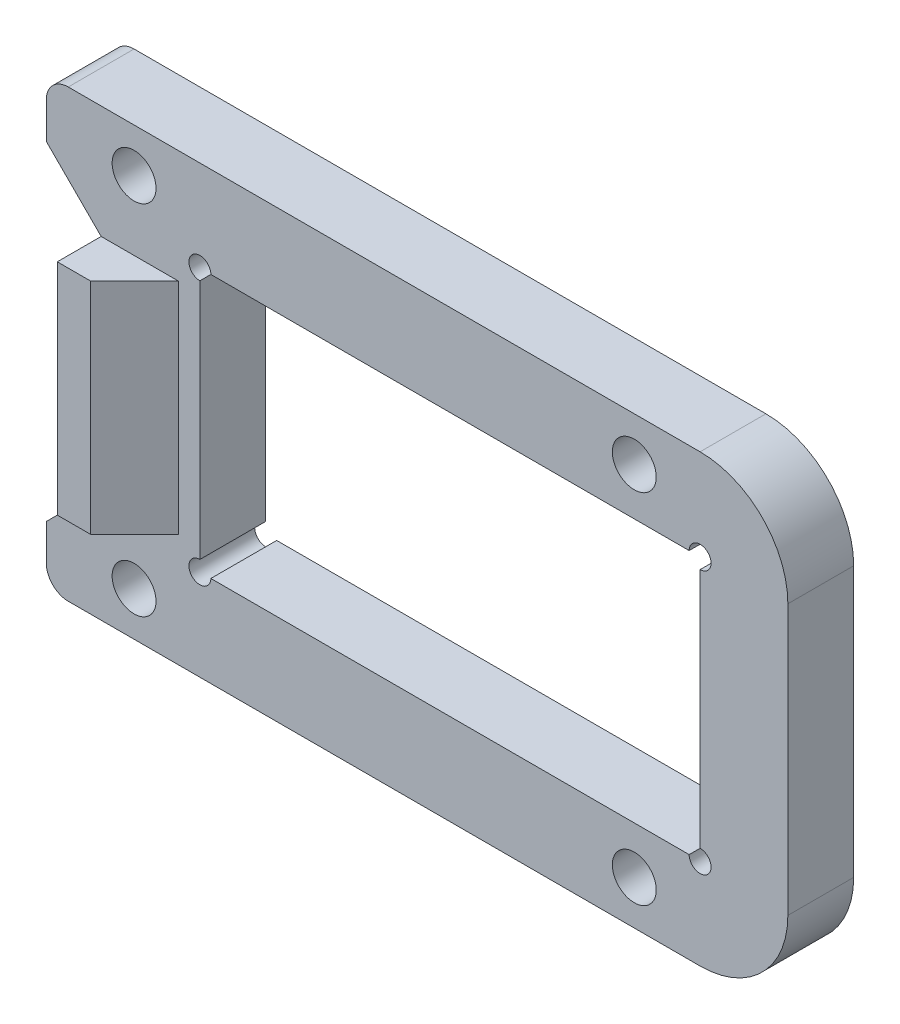
ISO-10303-21;
HEADER;
FILE_DESCRIPTION(('STEP AP214'),'2;1');
FILE_NAME('part.step','',(''),(''),'','','');
FILE_SCHEMA(('AUTOMOTIVE_DESIGN { 1 0 10303 214 1 1 1 1 }'));
ENDSEC;
DATA;
#1=APPLICATION_CONTEXT('core data for automotive mechanical design processes');
#2=APPLICATION_PROTOCOL_DEFINITION('international standard','automotive_design',2000,#1);
#3=PRODUCT_CONTEXT('',#1,'mechanical');
#4=PRODUCT('Part','Part','',(#3));
#5=PRODUCT_RELATED_PRODUCT_CATEGORY('part','',(#4));
#6=PRODUCT_DEFINITION_FORMATION('','',#4);
#7=PRODUCT_DEFINITION_CONTEXT('part definition',#1,'design');
#8=PRODUCT_DEFINITION('design','',#6,#7);
#9=PRODUCT_DEFINITION_SHAPE('','',#8);
#10=(LENGTH_UNIT() NAMED_UNIT(*) SI_UNIT(.MILLI.,.METRE.));
#11=(NAMED_UNIT(*) PLANE_ANGLE_UNIT() SI_UNIT($,.RADIAN.));
#12=(NAMED_UNIT(*) SI_UNIT($,.STERADIAN.) SOLID_ANGLE_UNIT());
#13=UNCERTAINTY_MEASURE_WITH_UNIT(LENGTH_MEASURE(1.E-05),#10,'distance_accuracy_value','');
#14=(GEOMETRIC_REPRESENTATION_CONTEXT(3) GLOBAL_UNCERTAINTY_ASSIGNED_CONTEXT((#13)) GLOBAL_UNIT_ASSIGNED_CONTEXT((#10,
#11,#12)) REPRESENTATION_CONTEXT('',''));
#15=CARTESIAN_POINT('',(0.,0.,0.));
#16=DIRECTION('',(0.,0.,1.));
#17=DIRECTION('',(1.,0.,0.));
#18=AXIS2_PLACEMENT_3D('',#15,#16,#17);
#19=CARTESIAN_POINT('',(0.,0.,3.));
#20=DIRECTION('',(0.,0.,1.));
#21=DIRECTION('',(1.,0.,0.));
#22=AXIS2_PLACEMENT_3D('',#19,#20,#21);
#23=PLANE('',#22);
#24=DIRECTION('',(0.,-1.,0.));
#25=VECTOR('',#24,1.);
#26=CARTESIAN_POINT('',(47.485959930444,0.,3.));
#27=LINE('',#26,#25);
#28=CARTESIAN_POINT('',(47.485959930444,6.29297996522203,3.));
#29=VERTEX_POINT('',#28);
#30=CARTESIAN_POINT('',(47.485959930444,-4.70702003477797,3.));
#31=VERTEX_POINT('',#30);
#32=EDGE_CURVE('E441',#29,#31,#27,.T.);
#33=ORIENTED_EDGE('',*,*,#32,.T.);
#34=CARTESIAN_POINT('',(47.485959930444,-5.20702003477797,3.));
#35=DIRECTION('',(0.,0.,-1.));
#36=DIRECTION('',(1.,0.,0.));
#37=AXIS2_PLACEMENT_3D('',#34,#35,#36);
#38=CIRCLE('',#37,0.5);
#39=CARTESIAN_POINT('',(46.985959930444,-5.20702003477797,3.));
#40=VERTEX_POINT('',#39);
#41=EDGE_CURVE('E397',#31,#40,#38,.T.);
#42=ORIENTED_EDGE('',*,*,#41,.T.);
#43=DIRECTION('',(1.,0.,0.));
#44=VECTOR('',#43,1.);
#45=CARTESIAN_POINT('',(0.,-5.20702003477798,3.));
#46=LINE('',#45,#44);
#47=CARTESIAN_POINT('',(25.185959930444,-5.20702003477797,3.));
#48=VERTEX_POINT('',#47);
#49=EDGE_CURVE('E406',#48,#40,#46,.T.);
#50=ORIENTED_EDGE('',*,*,#49,.F.);
#51=CARTESIAN_POINT('',(24.685959930444,-5.20702003477797,3.));
#52=DIRECTION('',(0.,0.,-1.));
#53=DIRECTION('',(1.,0.,0.));
#54=AXIS2_PLACEMENT_3D('',#51,#52,#53);
#55=CIRCLE('',#54,0.5);
#56=CARTESIAN_POINT('',(24.685959930444,-4.70702003477798,3.));
#57=VERTEX_POINT('',#56);
#58=EDGE_CURVE('E403',#48,#57,#55,.T.);
#59=ORIENTED_EDGE('',*,*,#58,.T.);
#60=DIRECTION('',(0.,-1.,0.));
#61=VECTOR('',#60,1.);
#62=CARTESIAN_POINT('',(24.685959930444,0.,3.));
#63=LINE('',#62,#61);
#64=CARTESIAN_POINT('',(24.685959930444,6.29297996522203,3.));
#65=VERTEX_POINT('',#64);
#66=EDGE_CURVE('E255',#65,#57,#63,.T.);
#67=ORIENTED_EDGE('',*,*,#66,.F.);
#68=CARTESIAN_POINT('',(24.685959930444,6.79297996522203,3.));
#69=DIRECTION('',(0.,0.,1.));
#70=DIRECTION('',(1.,0.,0.));
#71=AXIS2_PLACEMENT_3D('',#68,#69,#70);
#72=CIRCLE('',#71,0.5);
#73=CARTESIAN_POINT('',(25.185959930444,6.79297996522203,3.));
#74=VERTEX_POINT('',#73);
#75=EDGE_CURVE('E261',#74,#65,#72,.T.);
#76=ORIENTED_EDGE('',*,*,#75,.F.);
#77=DIRECTION('',(1.,0.,0.));
#78=VECTOR('',#77,1.);
#79=CARTESIAN_POINT('',(0.,6.79297996522203,3.));
#80=LINE('',#79,#78);
#81=CARTESIAN_POINT('',(46.985959930444,6.79297996522203,3.));
#82=VERTEX_POINT('',#81);
#83=EDGE_CURVE('E264',#74,#82,#80,.T.);
#84=ORIENTED_EDGE('',*,*,#83,.T.);
#85=CARTESIAN_POINT('',(47.485959930444,6.79297996522203,3.));
#86=DIRECTION('',(0.,0.,1.));
#87=DIRECTION('',(1.,0.,0.));
#88=AXIS2_PLACEMENT_3D('',#85,#86,#87);
#89=CIRCLE('',#88,0.5);
#90=EDGE_CURVE('E296',#29,#82,#89,.T.);
#91=ORIENTED_EDGE('',*,*,#90,.F.);
#92=EDGE_LOOP('',(#33,#42,#50,#59,#67,#76,#84,#91));
#93=FACE_BOUND('',#92,.T.);
#94=CARTESIAN_POINT('',(21.685959930444,8.94297996522203,3.));
#95=DIRECTION('',(0.,0.,1.));
#96=DIRECTION('',(1.,0.,0.));
#97=AXIS2_PLACEMENT_3D('',#94,#95,#96);
#98=CIRCLE('',#97,1.);
#99=CARTESIAN_POINT('',(22.685959930444,8.94297996522203,3.));
#100=VERTEX_POINT('',#99);
#101=EDGE_CURVE('E266',#100,#100,#98,.T.);
#102=ORIENTED_EDGE('',*,*,#101,.F.);
#103=EDGE_LOOP('',(#102));
#104=FACE_BOUND('',#103,.T.);
#105=CARTESIAN_POINT('',(44.485959930444,8.94297996522203,3.));
#106=DIRECTION('',(0.,0.,1.));
#107=DIRECTION('',(1.,0.,0.));
#108=AXIS2_PLACEMENT_3D('',#105,#106,#107);
#109=CIRCLE('',#108,0.999999999999998);
#110=CARTESIAN_POINT('',(45.485959930444,8.94297996522203,3.));
#111=VERTEX_POINT('',#110);
#112=EDGE_CURVE('E274',#111,#111,#109,.T.);
#113=ORIENTED_EDGE('',*,*,#112,.F.);
#114=EDGE_LOOP('',(#113));
#115=FACE_BOUND('',#114,.T.);
#116=CARTESIAN_POINT('',(21.685959930444,-7.35702003477797,3.));
#117=DIRECTION('',(0.,0.,-1.));
#118=DIRECTION('',(1.,0.,0.));
#119=AXIS2_PLACEMENT_3D('',#116,#117,#118);
#120=CIRCLE('',#119,1.);
#121=CARTESIAN_POINT('',(22.685959930444,-7.35702003477797,3.));
#122=VERTEX_POINT('',#121);
#123=EDGE_CURVE('E409',#122,#122,#120,.T.);
#124=ORIENTED_EDGE('',*,*,#123,.T.);
#125=EDGE_LOOP('',(#124));
#126=FACE_BOUND('',#125,.T.);
#127=CARTESIAN_POINT('',(44.485959930444,-7.35702003477797,3.));
#128=DIRECTION('',(0.,0.,-1.));
#129=DIRECTION('',(1.,0.,0.));
#130=AXIS2_PLACEMENT_3D('',#127,#128,#129);
#131=CIRCLE('',#130,0.999999999999998);
#132=CARTESIAN_POINT('',(45.485959930444,-7.35702003477797,3.));
#133=VERTEX_POINT('',#132);
#134=EDGE_CURVE('E391',#133,#133,#131,.T.);
#135=ORIENTED_EDGE('',*,*,#134,.T.);
#136=EDGE_LOOP('',(#135));
#137=FACE_BOUND('',#136,.T.);
#138=DIRECTION('',(1.,0.,0.));
#139=VECTOR('',#138,1.);
#140=CARTESIAN_POINT('',(0.,-4.20702003477797,3.));
#141=LINE('',#140,#139);
#142=CARTESIAN_POINT('',(20.185959930444,-4.20702003477797,3.));
#143=VERTEX_POINT('',#142);
#144=CARTESIAN_POINT('',(23.7012187742529,-4.20702003477797,3.));
#145=VERTEX_POINT('',#144);
#146=EDGE_CURVE('E245',#143,#145,#141,.T.);
#147=ORIENTED_EDGE('',*,*,#146,.F.);
#148=DIRECTION('',(-0.707106781186541,-0.707106781186554,0.));
#149=VECTOR('',#148,1.);
#150=CARTESIAN_POINT('',(20.185959930444,-4.20702003477797,3.));
#151=LINE('',#150,#149);
#152=CARTESIAN_POINT('',(17.6859599304441,-6.70702003477797,3.));
#153=VERTEX_POINT('',#152);
#154=EDGE_CURVE('E232',#143,#153,#151,.T.);
#155=ORIENTED_EDGE('',*,*,#154,.T.);
#156=DIRECTION('',(0.,-1.,0.));
#157=VECTOR('',#156,1.);
#158=CARTESIAN_POINT('',(17.6859599304441,0.,3.));
#159=LINE('',#158,#157);
#160=CARTESIAN_POINT('',(17.6859599304441,-8.35702003477798,3.));
#161=VERTEX_POINT('',#160);
#162=EDGE_CURVE('E241',#153,#161,#159,.T.);
#163=ORIENTED_EDGE('',*,*,#162,.T.);
#164=CARTESIAN_POINT('',(18.6859599304441,-8.35702003477798,3.));
#165=DIRECTION('',(0.,0.,1.));
#166=DIRECTION('',(1.,0.,0.));
#167=AXIS2_PLACEMENT_3D('',#164,#165,#166);
#168=CIRCLE('',#167,1.);
#169=CARTESIAN_POINT('',(18.6859599304441,-9.35702003477798,3.));
#170=VERTEX_POINT('',#169);
#171=EDGE_CURVE('E89',#161,#170,#168,.T.);
#172=ORIENTED_EDGE('',*,*,#171,.T.);
#173=DIRECTION('',(1.,0.,0.));
#174=VECTOR('',#173,1.);
#175=CARTESIAN_POINT('',(0.,-9.35702003477798,3.));
#176=LINE('',#175,#174);
#177=CARTESIAN_POINT('',(47.485959930444,-9.35702003477797,3.));
#178=VERTEX_POINT('',#177);
#179=EDGE_CURVE('E400',#170,#178,#176,.T.);
#180=ORIENTED_EDGE('',*,*,#179,.T.);
#181=CARTESIAN_POINT('',(47.485959930444,-5.35702003477797,3.));
#182=DIRECTION('',(0.,0.,1.));
#183=DIRECTION('',(1.,0.,0.));
#184=AXIS2_PLACEMENT_3D('',#181,#182,#183);
#185=CIRCLE('',#184,4.);
#186=CARTESIAN_POINT('',(51.485959930444,-5.35702003477797,3.));
#187=VERTEX_POINT('',#186);
#188=EDGE_CURVE('E323',#178,#187,#185,.T.);
#189=ORIENTED_EDGE('',*,*,#188,.T.);
#190=DIRECTION('',(0.,-1.,0.));
#191=VECTOR('',#190,1.);
#192=CARTESIAN_POINT('',(51.485959930444,0.,3.));
#193=LINE('',#192,#191);
#194=CARTESIAN_POINT('',(51.485959930444,6.94297996522203,3.));
#195=VERTEX_POINT('',#194);
#196=EDGE_CURVE('E256',#195,#187,#193,.T.);
#197=ORIENTED_EDGE('',*,*,#196,.F.);
#198=CARTESIAN_POINT('',(47.485959930444,6.94297996522203,3.));
#199=DIRECTION('',(0.,0.,1.));
#200=DIRECTION('',(1.,0.,0.));
#201=AXIS2_PLACEMENT_3D('',#198,#199,#200);
#202=CIRCLE('',#201,4.);
#203=CARTESIAN_POINT('',(47.485959930444,10.942979965222,3.));
#204=VERTEX_POINT('',#203);
#205=EDGE_CURVE('E325',#195,#204,#202,.T.);
#206=ORIENTED_EDGE('',*,*,#205,.T.);
#207=DIRECTION('',(1.,0.,0.));
#208=VECTOR('',#207,1.);
#209=CARTESIAN_POINT('',(0.,10.942979965222,3.));
#210=LINE('',#209,#208);
#211=CARTESIAN_POINT('',(18.685959930444,10.942979965222,3.));
#212=VERTEX_POINT('',#211);
#213=EDGE_CURVE('E252',#212,#204,#210,.T.);
#214=ORIENTED_EDGE('',*,*,#213,.F.);
#215=CARTESIAN_POINT('',(18.685959930444,9.94297996522203,3.));
#216=DIRECTION('',(0.,0.,1.));
#217=DIRECTION('',(1.,0.,0.));
#218=AXIS2_PLACEMENT_3D('',#215,#216,#217);
#219=CIRCLE('',#218,1.);
#220=CARTESIAN_POINT('',(17.685959930444,9.94297996522203,3.));
#221=VERTEX_POINT('',#220);
#222=EDGE_CURVE('E342',#212,#221,#219,.T.);
#223=ORIENTED_EDGE('',*,*,#222,.T.);
#224=CARTESIAN_POINT('',(17.685959930444,8.292979965222,3.));
#225=VERTEX_POINT('',#224);
#226=EDGE_CURVE('E251',#221,#225,#159,.T.);
#227=ORIENTED_EDGE('',*,*,#226,.T.);
#228=DIRECTION('',(-0.707106781186551,0.707106781186544,0.));
#229=VECTOR('',#228,1.);
#230=CARTESIAN_POINT('',(20.185959930444,5.79297996522203,3.));
#231=LINE('',#230,#229);
#232=CARTESIAN_POINT('',(20.185959930444,5.79297996522203,3.));
#233=VERTEX_POINT('',#232);
#234=EDGE_CURVE('E246',#233,#225,#231,.T.);
#235=ORIENTED_EDGE('',*,*,#234,.F.);
#236=DIRECTION('',(1.,0.,0.));
#237=VECTOR('',#236,1.);
#238=CARTESIAN_POINT('',(0.,5.79297996522203,3.));
#239=LINE('',#238,#237);
#240=CARTESIAN_POINT('',(23.7012187742529,5.79297996522203,3.));
#241=VERTEX_POINT('',#240);
#242=EDGE_CURVE('E383',#233,#241,#239,.T.);
#243=ORIENTED_EDGE('',*,*,#242,.T.);
#244=DIRECTION('',(0.,-1.,0.));
#245=VECTOR('',#244,1.);
#246=CARTESIAN_POINT('',(23.7012187742529,0.,3.));
#247=LINE('',#246,#245);
#248=EDGE_CURVE('E367',#241,#145,#247,.T.);
#249=ORIENTED_EDGE('',*,*,#248,.T.);
#250=EDGE_LOOP('',(#147,#155,#163,#172,#180,#189,#197,#206,#214,#223,#227,#235,#243,#249));
#251=FACE_BOUND('',#250,.T.);
#252=ADVANCED_FACE('F74',(#93,#104,#115,#126,#137,#251),#23,.T.);
#253=CARTESIAN_POINT('',(0.,0.,0.));
#254=DIRECTION('',(0.,0.,1.));
#255=DIRECTION('',(1.,0.,0.));
#256=AXIS2_PLACEMENT_3D('',#253,#254,#255);
#257=PLANE('',#256);
#258=CARTESIAN_POINT('',(44.485959930444,-7.35702003477797,0.));
#259=DIRECTION('',(0.,0.,-1.));
#260=DIRECTION('',(1.,0.,0.));
#261=AXIS2_PLACEMENT_3D('',#258,#259,#260);
#262=CIRCLE('',#261,0.999999999999998);
#263=CARTESIAN_POINT('',(45.485959930444,-7.35702003477797,0.));
#264=VERTEX_POINT('',#263);
#265=EDGE_CURVE('E390',#264,#264,#262,.T.);
#266=ORIENTED_EDGE('',*,*,#265,.F.);
#267=EDGE_LOOP('',(#266));
#268=FACE_BOUND('',#267,.T.);
#269=CARTESIAN_POINT('',(21.685959930444,-7.35702003477797,0.));
#270=DIRECTION('',(0.,0.,-1.));
#271=DIRECTION('',(1.,0.,0.));
#272=AXIS2_PLACEMENT_3D('',#269,#270,#271);
#273=CIRCLE('',#272,1.);
#274=CARTESIAN_POINT('',(22.685959930444,-7.35702003477797,0.));
#275=VERTEX_POINT('',#274);
#276=EDGE_CURVE('E401',#275,#275,#273,.T.);
#277=ORIENTED_EDGE('',*,*,#276,.F.);
#278=EDGE_LOOP('',(#277));
#279=FACE_BOUND('',#278,.T.);
#280=CARTESIAN_POINT('',(44.485959930444,8.94297996522203,0.));
#281=DIRECTION('',(0.,0.,1.));
#282=DIRECTION('',(1.,0.,0.));
#283=AXIS2_PLACEMENT_3D('',#280,#281,#282);
#284=CIRCLE('',#283,0.999999999999998);
#285=CARTESIAN_POINT('',(45.485959930444,8.94297996522203,0.));
#286=VERTEX_POINT('',#285);
#287=EDGE_CURVE('E434',#286,#286,#284,.T.);
#288=ORIENTED_EDGE('',*,*,#287,.T.);
#289=EDGE_LOOP('',(#288));
#290=FACE_BOUND('',#289,.T.);
#291=CARTESIAN_POINT('',(21.685959930444,8.94297996522203,0.));
#292=DIRECTION('',(0.,0.,1.));
#293=DIRECTION('',(1.,0.,0.));
#294=AXIS2_PLACEMENT_3D('',#291,#292,#293);
#295=CIRCLE('',#294,1.);
#296=CARTESIAN_POINT('',(22.685959930444,8.94297996522203,0.));
#297=VERTEX_POINT('',#296);
#298=EDGE_CURVE('E293',#297,#297,#295,.T.);
#299=ORIENTED_EDGE('',*,*,#298,.T.);
#300=EDGE_LOOP('',(#299));
#301=FACE_BOUND('',#300,.T.);
#302=CARTESIAN_POINT('',(47.485959930444,-5.20702003477797,0.));
#303=DIRECTION('',(0.,0.,-1.));
#304=DIRECTION('',(1.,0.,0.));
#305=AXIS2_PLACEMENT_3D('',#302,#303,#304);
#306=CIRCLE('',#305,0.5);
#307=CARTESIAN_POINT('',(47.485959930444,-4.70702003477797,0.));
#308=VERTEX_POINT('',#307);
#309=CARTESIAN_POINT('',(46.985959930444,-5.20702003477797,0.));
#310=VERTEX_POINT('',#309);
#311=EDGE_CURVE('E394',#308,#310,#306,.T.);
#312=ORIENTED_EDGE('',*,*,#311,.F.);
#313=DIRECTION('',(0.,-1.,0.));
#314=VECTOR('',#313,1.);
#315=CARTESIAN_POINT('',(47.485959930444,0.,0.));
#316=LINE('',#315,#314);
#317=CARTESIAN_POINT('',(47.485959930444,6.29297996522203,0.));
#318=VERTEX_POINT('',#317);
#319=EDGE_CURVE('E273',#318,#308,#316,.T.);
#320=ORIENTED_EDGE('',*,*,#319,.F.);
#321=CARTESIAN_POINT('',(47.485959930444,6.79297996522203,0.));
#322=DIRECTION('',(0.,0.,1.));
#323=DIRECTION('',(1.,0.,0.));
#324=AXIS2_PLACEMENT_3D('',#321,#322,#323);
#325=CIRCLE('',#324,0.5);
#326=CARTESIAN_POINT('',(46.985959930444,6.79297996522203,0.));
#327=VERTEX_POINT('',#326);
#328=EDGE_CURVE('E270',#318,#327,#325,.T.);
#329=ORIENTED_EDGE('',*,*,#328,.T.);
#330=DIRECTION('',(1.,0.,0.));
#331=VECTOR('',#330,1.);
#332=CARTESIAN_POINT('',(0.,6.79297996522203,0.));
#333=LINE('',#332,#331);
#334=CARTESIAN_POINT('',(25.185959930444,6.79297996522203,0.));
#335=VERTEX_POINT('',#334);
#336=EDGE_CURVE('E290',#335,#327,#333,.T.);
#337=ORIENTED_EDGE('',*,*,#336,.F.);
#338=CARTESIAN_POINT('',(24.685959930444,6.79297996522203,0.));
#339=DIRECTION('',(0.,0.,1.));
#340=DIRECTION('',(1.,0.,0.));
#341=AXIS2_PLACEMENT_3D('',#338,#339,#340);
#342=CIRCLE('',#341,0.5);
#343=CARTESIAN_POINT('',(24.685959930444,6.29297996522203,0.));
#344=VERTEX_POINT('',#343);
#345=EDGE_CURVE('E287',#335,#344,#342,.T.);
#346=ORIENTED_EDGE('',*,*,#345,.T.);
#347=DIRECTION('',(0.,-1.,0.));
#348=VECTOR('',#347,1.);
#349=CARTESIAN_POINT('',(24.685959930444,0.,0.));
#350=LINE('',#349,#348);
#351=CARTESIAN_POINT('',(24.685959930444,-4.70702003477798,0.));
#352=VERTEX_POINT('',#351);
#353=EDGE_CURVE('E285',#344,#352,#350,.T.);
#354=ORIENTED_EDGE('',*,*,#353,.T.);
#355=CARTESIAN_POINT('',(24.685959930444,-5.20702003477797,0.));
#356=DIRECTION('',(0.,0.,-1.));
#357=DIRECTION('',(1.,0.,0.));
#358=AXIS2_PLACEMENT_3D('',#355,#356,#357);
#359=CIRCLE('',#358,0.5);
#360=CARTESIAN_POINT('',(25.185959930444,-5.20702003477797,0.));
#361=VERTEX_POINT('',#360);
#362=EDGE_CURVE('E417',#361,#352,#359,.T.);
#363=ORIENTED_EDGE('',*,*,#362,.F.);
#364=DIRECTION('',(1.,0.,0.));
#365=VECTOR('',#364,1.);
#366=CARTESIAN_POINT('',(0.,-5.20702003477798,0.));
#367=LINE('',#366,#365);
#368=EDGE_CURVE('E420',#361,#310,#367,.T.);
#369=ORIENTED_EDGE('',*,*,#368,.T.);
#370=EDGE_LOOP('',(#312,#320,#329,#337,#346,#354,#363,#369));
#371=FACE_BOUND('',#370,.T.);
#372=DIRECTION('',(-0.707106781186541,-0.707106781186554,0.));
#373=VECTOR('',#372,1.);
#374=CARTESIAN_POINT('',(12.1964899826112,-12.196489982611,0.));
#375=LINE('',#374,#373);
#376=CARTESIAN_POINT('',(20.185959930444,-4.20702003477797,0.));
#377=VERTEX_POINT('',#376);
#378=CARTESIAN_POINT('',(17.6859599304441,-6.70702003477797,0.));
#379=VERTEX_POINT('',#378);
#380=EDGE_CURVE('E235',#377,#379,#375,.T.);
#381=ORIENTED_EDGE('',*,*,#380,.F.);
#382=DIRECTION('',(0.,1.,0.));
#383=VECTOR('',#382,1.);
#384=CARTESIAN_POINT('',(20.185959930444,0.,0.));
#385=LINE('',#384,#383);
#386=CARTESIAN_POINT('',(20.185959930444,5.79297996522203,0.));
#387=VERTEX_POINT('',#386);
#388=EDGE_CURVE('E12',#377,#387,#385,.T.);
#389=ORIENTED_EDGE('',*,*,#388,.T.);
#390=DIRECTION('',(-0.707106781186551,0.707106781186544,0.));
#391=VECTOR('',#390,1.);
#392=CARTESIAN_POINT('',(12.9894699478329,12.9894699478331,0.));
#393=LINE('',#392,#391);
#394=CARTESIAN_POINT('',(17.685959930444,8.292979965222,0.));
#395=VERTEX_POINT('',#394);
#396=EDGE_CURVE('E363',#387,#395,#393,.T.);
#397=ORIENTED_EDGE('',*,*,#396,.T.);
#398=DIRECTION('',(0.,-1.,0.));
#399=VECTOR('',#398,1.);
#400=CARTESIAN_POINT('',(17.6859599304441,0.,0.));
#401=LINE('',#400,#399);
#402=CARTESIAN_POINT('',(17.685959930444,9.94297996522203,0.));
#403=VERTEX_POINT('',#402);
#404=EDGE_CURVE('E282',#403,#395,#401,.T.);
#405=ORIENTED_EDGE('',*,*,#404,.F.);
#406=CARTESIAN_POINT('',(18.685959930444,9.94297996522203,0.));
#407=DIRECTION('',(0.,0.,1.));
#408=DIRECTION('',(1.,0.,0.));
#409=AXIS2_PLACEMENT_3D('',#406,#407,#408);
#410=CIRCLE('',#409,1.);
#411=CARTESIAN_POINT('',(18.685959930444,10.942979965222,0.));
#412=VERTEX_POINT('',#411);
#413=EDGE_CURVE('E338',#403,#412,#410,.F.);
#414=ORIENTED_EDGE('',*,*,#413,.T.);
#415=DIRECTION('',(1.,0.,0.));
#416=VECTOR('',#415,1.);
#417=CARTESIAN_POINT('',(0.,10.942979965222,0.));
#418=LINE('',#417,#416);
#419=CARTESIAN_POINT('',(47.485959930444,10.942979965222,0.));
#420=VERTEX_POINT('',#419);
#421=EDGE_CURVE('E279',#412,#420,#418,.T.);
#422=ORIENTED_EDGE('',*,*,#421,.T.);
#423=CARTESIAN_POINT('',(47.485959930444,6.94297996522203,0.));
#424=DIRECTION('',(0.,0.,1.));
#425=DIRECTION('',(1.,0.,0.));
#426=AXIS2_PLACEMENT_3D('',#423,#424,#425);
#427=CIRCLE('',#426,4.);
#428=CARTESIAN_POINT('',(51.485959930444,6.94297996522203,0.));
#429=VERTEX_POINT('',#428);
#430=EDGE_CURVE('E316',#420,#429,#427,.F.);
#431=ORIENTED_EDGE('',*,*,#430,.T.);
#432=DIRECTION('',(0.,-1.,0.));
#433=VECTOR('',#432,1.);
#434=CARTESIAN_POINT('',(51.485959930444,0.,0.));
#435=LINE('',#434,#433);
#436=CARTESIAN_POINT('',(51.485959930444,-5.35702003477797,0.));
#437=VERTEX_POINT('',#436);
#438=EDGE_CURVE('E276',#429,#437,#435,.T.);
#439=ORIENTED_EDGE('',*,*,#438,.T.);
#440=CARTESIAN_POINT('',(47.485959930444,-5.35702003477797,0.));
#441=DIRECTION('',(0.,0.,1.));
#442=DIRECTION('',(1.,0.,0.));
#443=AXIS2_PLACEMENT_3D('',#440,#441,#442);
#444=CIRCLE('',#443,4.);
#445=CARTESIAN_POINT('',(47.485959930444,-9.35702003477797,0.));
#446=VERTEX_POINT('',#445);
#447=EDGE_CURVE('E313',#437,#446,#444,.F.);
#448=ORIENTED_EDGE('',*,*,#447,.T.);
#449=DIRECTION('',(1.,0.,0.));
#450=VECTOR('',#449,1.);
#451=CARTESIAN_POINT('',(0.,-9.35702003477798,0.));
#452=LINE('',#451,#450);
#453=CARTESIAN_POINT('',(18.6859599304441,-9.35702003477798,0.));
#454=VERTEX_POINT('',#453);
#455=EDGE_CURVE('E415',#454,#446,#452,.T.);
#456=ORIENTED_EDGE('',*,*,#455,.F.);
#457=CARTESIAN_POINT('',(18.6859599304441,-8.35702003477798,0.));
#458=DIRECTION('',(0.,0.,1.));
#459=DIRECTION('',(1.,0.,0.));
#460=AXIS2_PLACEMENT_3D('',#457,#458,#459);
#461=CIRCLE('',#460,1.);
#462=CARTESIAN_POINT('',(17.6859599304441,-8.35702003477798,0.));
#463=VERTEX_POINT('',#462);
#464=EDGE_CURVE('E335',#454,#463,#461,.F.);
#465=ORIENTED_EDGE('',*,*,#464,.T.);
#466=EDGE_CURVE('E281',#379,#463,#401,.T.);
#467=ORIENTED_EDGE('',*,*,#466,.F.);
#468=EDGE_LOOP('',(#381,#389,#397,#405,#414,#422,#431,#439,#448,#456,#465,#467));
#469=FACE_BOUND('',#468,.T.);
#470=ADVANCED_FACE('F362',(#268,#279,#290,#301,#371,#469),#257,.F.);
#471=CARTESIAN_POINT('',(17.6859599304441,0.,3.));
#472=DIRECTION('',(1.,0.,0.));
#473=DIRECTION('',(0.,1.,0.));
#474=AXIS2_PLACEMENT_3D('',#471,#472,#473);
#475=PLANE('',#474);
#476=DIRECTION('',(0.,0.,1.));
#477=VECTOR('',#476,1.);
#478=CARTESIAN_POINT('',(17.6859599304441,-6.70702003477797,3.));
#479=LINE('',#478,#477);
#480=EDGE_CURVE('E82',#379,#153,#479,.T.);
#481=ORIENTED_EDGE('',*,*,#480,.F.);
#482=ORIENTED_EDGE('',*,*,#466,.T.);
#483=DIRECTION('',(0.,0.,-1.));
#484=VECTOR('',#483,1.);
#485=CARTESIAN_POINT('',(17.6859599304441,-8.35702003477798,3.));
#486=LINE('',#485,#484);
#487=EDGE_CURVE('E250',#463,#161,#486,.F.);
#488=ORIENTED_EDGE('',*,*,#487,.T.);
#489=ORIENTED_EDGE('',*,*,#162,.F.);
#490=EDGE_LOOP('',(#481,#482,#488,#489));
#491=FACE_BOUND('',#490,.T.);
#492=ADVANCED_FACE('F248',(#491),#475,.F.);
#493=CARTESIAN_POINT('',(47.485959930444,6.79297996522203,3.));
#494=DIRECTION('',(0.,0.,-1.));
#495=DIRECTION('',(-1.,0.,0.));
#496=AXIS2_PLACEMENT_3D('',#493,#494,#495);
#497=CYLINDRICAL_SURFACE('',#496,0.5);
#498=ORIENTED_EDGE('',*,*,#328,.F.);
#499=DIRECTION('',(0.,0.,-1.));
#500=VECTOR('',#499,1.);
#501=CARTESIAN_POINT('',(47.485959930444,6.29297996522203,3.));
#502=LINE('',#501,#500);
#503=EDGE_CURVE('E302',#29,#318,#502,.T.);
#504=ORIENTED_EDGE('',*,*,#503,.F.);
#505=ORIENTED_EDGE('',*,*,#90,.T.);
#506=DIRECTION('',(0.,0.,-1.));
#507=VECTOR('',#506,1.);
#508=CARTESIAN_POINT('',(46.985959930444,6.79297996522203,3.));
#509=LINE('',#508,#507);
#510=EDGE_CURVE('E269',#82,#327,#509,.T.);
#511=ORIENTED_EDGE('',*,*,#510,.T.);
#512=EDGE_LOOP('',(#498,#504,#505,#511));
#513=FACE_BOUND('',#512,.T.);
#514=ADVANCED_FACE('F526',(#513),#497,.F.);
#515=CARTESIAN_POINT('',(47.485959930444,0.,3.));
#516=DIRECTION('',(1.,0.,0.));
#517=DIRECTION('',(0.,0.,-1.));
#518=AXIS2_PLACEMENT_3D('',#515,#516,#517);
#519=PLANE('',#518);
#520=ORIENTED_EDGE('',*,*,#319,.T.);
#521=DIRECTION('',(0.,0.,-1.));
#522=VECTOR('',#521,1.);
#523=CARTESIAN_POINT('',(47.485959930444,-4.70702003477797,3.));
#524=LINE('',#523,#522);
#525=EDGE_CURVE('E431',#31,#308,#524,.T.);
#526=ORIENTED_EDGE('',*,*,#525,.F.);
#527=ORIENTED_EDGE('',*,*,#32,.F.);
#528=ORIENTED_EDGE('',*,*,#503,.T.);
#529=EDGE_LOOP('',(#520,#526,#527,#528));
#530=FACE_BOUND('',#529,.T.);
#531=ADVANCED_FACE('F468',(#530),#519,.F.);
#532=CARTESIAN_POINT('',(51.485959930444,0.,3.));
#533=DIRECTION('',(1.,0.,0.));
#534=DIRECTION('',(0.,0.,-1.));
#535=AXIS2_PLACEMENT_3D('',#532,#533,#534);
#536=PLANE('',#535);
#537=ORIENTED_EDGE('',*,*,#438,.F.);
#538=DIRECTION('',(0.,0.,-1.));
#539=VECTOR('',#538,1.);
#540=CARTESIAN_POINT('',(51.485959930444,6.94297996522203,3.));
#541=LINE('',#540,#539);
#542=EDGE_CURVE('E321',#429,#195,#541,.F.);
#543=ORIENTED_EDGE('',*,*,#542,.T.);
#544=ORIENTED_EDGE('',*,*,#196,.T.);
#545=DIRECTION('',(0.,0.,-1.));
#546=VECTOR('',#545,1.);
#547=CARTESIAN_POINT('',(51.485959930444,-5.35702003477797,3.));
#548=LINE('',#547,#546);
#549=EDGE_CURVE('E318',#187,#437,#548,.T.);
#550=ORIENTED_EDGE('',*,*,#549,.T.);
#551=EDGE_LOOP('',(#537,#543,#544,#550));
#552=FACE_BOUND('',#551,.T.);
#553=ADVANCED_FACE('F447',(#552),#536,.T.);
#554=CARTESIAN_POINT('',(0.,10.942979965222,3.));
#555=DIRECTION('',(0.,1.,0.));
#556=DIRECTION('',(-1.,0.,0.));
#557=AXIS2_PLACEMENT_3D('',#554,#555,#556);
#558=PLANE('',#557);
#559=ORIENTED_EDGE('',*,*,#421,.F.);
#560=DIRECTION('',(0.,0.,-1.));
#561=VECTOR('',#560,1.);
#562=CARTESIAN_POINT('',(18.685959930444,10.942979965222,3.));
#563=LINE('',#562,#561);
#564=EDGE_CURVE('E97',#412,#212,#563,.F.);
#565=ORIENTED_EDGE('',*,*,#564,.T.);
#566=ORIENTED_EDGE('',*,*,#213,.T.);
#567=DIRECTION('',(0.,0.,-1.));
#568=VECTOR('',#567,1.);
#569=CARTESIAN_POINT('',(47.485959930444,10.942979965222,3.));
#570=LINE('',#569,#568);
#571=EDGE_CURVE('E310',#204,#420,#570,.T.);
#572=ORIENTED_EDGE('',*,*,#571,.T.);
#573=EDGE_LOOP('',(#559,#565,#566,#572));
#574=FACE_BOUND('',#573,.T.);
#575=ADVANCED_FACE('F459',(#574),#558,.T.);
#576=ORIENTED_EDGE('',*,*,#404,.T.);
#577=DIRECTION('',(0.,0.,1.));
#578=VECTOR('',#577,1.);
#579=CARTESIAN_POINT('',(17.685959930444,8.292979965222,3.));
#580=LINE('',#579,#578);
#581=EDGE_CURVE('E239',#395,#225,#580,.T.);
#582=ORIENTED_EDGE('',*,*,#581,.T.);
#583=ORIENTED_EDGE('',*,*,#226,.F.);
#584=DIRECTION('',(0.,0.,-1.));
#585=VECTOR('',#584,1.);
#586=CARTESIAN_POINT('',(17.685959930444,9.94297996522203,0.));
#587=LINE('',#586,#585);
#588=EDGE_CURVE('E332',#221,#403,#587,.T.);
#589=ORIENTED_EDGE('',*,*,#588,.T.);
#590=EDGE_LOOP('',(#576,#582,#583,#589));
#591=FACE_BOUND('',#590,.T.);
#592=ADVANCED_FACE('F350',(#591),#475,.F.);
#593=CARTESIAN_POINT('',(24.685959930444,0.,3.));
#594=DIRECTION('',(1.,0.,0.));
#595=DIRECTION('',(0.,0.,-1.));
#596=AXIS2_PLACEMENT_3D('',#593,#594,#595);
#597=PLANE('',#596);
#598=ORIENTED_EDGE('',*,*,#353,.F.);
#599=DIRECTION('',(0.,0.,-1.));
#600=VECTOR('',#599,1.);
#601=CARTESIAN_POINT('',(24.685959930444,6.29297996522203,3.));
#602=LINE('',#601,#600);
#603=EDGE_CURVE('E300',#65,#344,#602,.T.);
#604=ORIENTED_EDGE('',*,*,#603,.F.);
#605=ORIENTED_EDGE('',*,*,#66,.T.);
#606=DIRECTION('',(0.,0.,-1.));
#607=VECTOR('',#606,1.);
#608=CARTESIAN_POINT('',(24.685959930444,-4.70702003477798,3.));
#609=LINE('',#608,#607);
#610=EDGE_CURVE('E428',#57,#352,#609,.T.);
#611=ORIENTED_EDGE('',*,*,#610,.T.);
#612=EDGE_LOOP('',(#598,#604,#605,#611));
#613=FACE_BOUND('',#612,.T.);
#614=ADVANCED_FACE('F466',(#613),#597,.T.);
#615=CARTESIAN_POINT('',(24.685959930444,6.79297996522203,3.));
#616=DIRECTION('',(0.,0.,-1.));
#617=DIRECTION('',(-1.,0.,0.));
#618=AXIS2_PLACEMENT_3D('',#615,#616,#617);
#619=CYLINDRICAL_SURFACE('',#618,0.5);
#620=ORIENTED_EDGE('',*,*,#345,.F.);
#621=DIRECTION('',(0.,0.,-1.));
#622=VECTOR('',#621,1.);
#623=CARTESIAN_POINT('',(25.185959930444,6.79297996522203,3.));
#624=LINE('',#623,#622);
#625=EDGE_CURVE('E298',#74,#335,#624,.T.);
#626=ORIENTED_EDGE('',*,*,#625,.F.);
#627=ORIENTED_EDGE('',*,*,#75,.T.);
#628=ORIENTED_EDGE('',*,*,#603,.T.);
#629=EDGE_LOOP('',(#620,#626,#627,#628));
#630=FACE_BOUND('',#629,.T.);
#631=ADVANCED_FACE('F490',(#630),#619,.F.);
#632=CARTESIAN_POINT('',(0.,6.79297996522203,3.));
#633=DIRECTION('',(0.,1.,0.));
#634=DIRECTION('',(-1.,0.,0.));
#635=AXIS2_PLACEMENT_3D('',#632,#633,#634);
#636=PLANE('',#635);
#637=ORIENTED_EDGE('',*,*,#336,.T.);
#638=ORIENTED_EDGE('',*,*,#510,.F.);
#639=ORIENTED_EDGE('',*,*,#83,.F.);
#640=ORIENTED_EDGE('',*,*,#625,.T.);
#641=EDGE_LOOP('',(#637,#638,#639,#640));
#642=FACE_BOUND('',#641,.T.);
#643=ADVANCED_FACE('F486',(#642),#636,.F.);
#644=CARTESIAN_POINT('',(21.685959930444,8.94297996522203,3.));
#645=DIRECTION('',(0.,0.,-1.));
#646=DIRECTION('',(-1.,0.,0.));
#647=AXIS2_PLACEMENT_3D('',#644,#645,#646);
#648=CYLINDRICAL_SURFACE('',#647,1.);
#649=ORIENTED_EDGE('',*,*,#101,.T.);
#650=EDGE_LOOP('',(#649));
#651=FACE_BOUND('',#650,.T.);
#652=ORIENTED_EDGE('',*,*,#298,.F.);
#653=EDGE_LOOP('',(#652));
#654=FACE_BOUND('',#653,.T.);
#655=ADVANCED_FACE('F483',(#651,#654),#648,.F.);
#656=CARTESIAN_POINT('',(44.485959930444,8.94297996522203,3.));
#657=DIRECTION('',(0.,0.,-1.));
#658=DIRECTION('',(-1.,0.,0.));
#659=AXIS2_PLACEMENT_3D('',#656,#657,#658);
#660=CYLINDRICAL_SURFACE('',#659,0.999999999999998);
#661=ORIENTED_EDGE('',*,*,#112,.T.);
#662=EDGE_LOOP('',(#661));
#663=FACE_BOUND('',#662,.T.);
#664=ORIENTED_EDGE('',*,*,#287,.F.);
#665=EDGE_LOOP('',(#664));
#666=FACE_BOUND('',#665,.T.);
#667=ADVANCED_FACE('F480',(#663,#666),#660,.F.);
#668=CARTESIAN_POINT('',(47.485959930444,-5.20702003477797,3.));
#669=DIRECTION('',(0.,0.,-1.));
#670=DIRECTION('',(-1.,0.,0.));
#671=AXIS2_PLACEMENT_3D('',#668,#669,#670);
#672=CYLINDRICAL_SURFACE('',#671,0.5);
#673=ORIENTED_EDGE('',*,*,#311,.T.);
#674=DIRECTION('',(0.,0.,-1.));
#675=VECTOR('',#674,1.);
#676=CARTESIAN_POINT('',(46.985959930444,-5.20702003477797,3.));
#677=LINE('',#676,#675);
#678=EDGE_CURVE('E412',#40,#310,#677,.T.);
#679=ORIENTED_EDGE('',*,*,#678,.F.);
#680=ORIENTED_EDGE('',*,*,#41,.F.);
#681=ORIENTED_EDGE('',*,*,#525,.T.);
#682=EDGE_LOOP('',(#673,#679,#680,#681));
#683=FACE_BOUND('',#682,.T.);
#684=ADVANCED_FACE('F519',(#683),#672,.F.);
#685=CARTESIAN_POINT('',(0.,-9.35702003477798,3.));
#686=DIRECTION('',(0.,-1.,0.));
#687=DIRECTION('',(-1.,0.,0.));
#688=AXIS2_PLACEMENT_3D('',#685,#686,#687);
#689=PLANE('',#688);
#690=ORIENTED_EDGE('',*,*,#179,.F.);
#691=DIRECTION('',(0.,0.,-1.));
#692=VECTOR('',#691,1.);
#693=CARTESIAN_POINT('',(18.6859599304441,-9.35702003477798,0.));
#694=LINE('',#693,#692);
#695=EDGE_CURVE('E344',#170,#454,#694,.T.);
#696=ORIENTED_EDGE('',*,*,#695,.T.);
#697=ORIENTED_EDGE('',*,*,#455,.T.);
#698=DIRECTION('',(0.,0.,-1.));
#699=VECTOR('',#698,1.);
#700=CARTESIAN_POINT('',(47.485959930444,-9.35702003477797,3.));
#701=LINE('',#700,#699);
#702=EDGE_CURVE('E328',#446,#178,#701,.F.);
#703=ORIENTED_EDGE('',*,*,#702,.T.);
#704=EDGE_LOOP('',(#690,#696,#697,#703));
#705=FACE_BOUND('',#704,.T.);
#706=ADVANCED_FACE('F538',(#705),#689,.T.);
#707=CARTESIAN_POINT('',(24.685959930444,-5.20702003477797,3.));
#708=DIRECTION('',(0.,0.,-1.));
#709=DIRECTION('',(-1.,0.,0.));
#710=AXIS2_PLACEMENT_3D('',#707,#708,#709);
#711=CYLINDRICAL_SURFACE('',#710,0.5);
#712=ORIENTED_EDGE('',*,*,#362,.T.);
#713=ORIENTED_EDGE('',*,*,#610,.F.);
#714=ORIENTED_EDGE('',*,*,#58,.F.);
#715=DIRECTION('',(0.,0.,-1.));
#716=VECTOR('',#715,1.);
#717=CARTESIAN_POINT('',(25.185959930444,-5.20702003477797,3.));
#718=LINE('',#717,#716);
#719=EDGE_CURVE('E426',#48,#361,#718,.T.);
#720=ORIENTED_EDGE('',*,*,#719,.T.);
#721=EDGE_LOOP('',(#712,#713,#714,#720));
#722=FACE_BOUND('',#721,.T.);
#723=ADVANCED_FACE('F514',(#722),#711,.F.);
#724=CARTESIAN_POINT('',(0.,-5.20702003477798,3.));
#725=DIRECTION('',(0.,-1.,0.));
#726=DIRECTION('',(-1.,0.,0.));
#727=AXIS2_PLACEMENT_3D('',#724,#725,#726);
#728=PLANE('',#727);
#729=ORIENTED_EDGE('',*,*,#368,.F.);
#730=ORIENTED_EDGE('',*,*,#719,.F.);
#731=ORIENTED_EDGE('',*,*,#49,.T.);
#732=ORIENTED_EDGE('',*,*,#678,.T.);
#733=EDGE_LOOP('',(#729,#730,#731,#732));
#734=FACE_BOUND('',#733,.T.);
#735=ADVANCED_FACE('F527',(#734),#728,.F.);
#736=CARTESIAN_POINT('',(21.685959930444,-7.35702003477797,3.));
#737=DIRECTION('',(0.,0.,-1.));
#738=DIRECTION('',(-1.,0.,0.));
#739=AXIS2_PLACEMENT_3D('',#736,#737,#738);
#740=CYLINDRICAL_SURFACE('',#739,1.);
#741=ORIENTED_EDGE('',*,*,#123,.F.);
#742=EDGE_LOOP('',(#741));
#743=FACE_BOUND('',#742,.T.);
#744=ORIENTED_EDGE('',*,*,#276,.T.);
#745=EDGE_LOOP('',(#744));
#746=FACE_BOUND('',#745,.T.);
#747=ADVANCED_FACE('F529',(#743,#746),#740,.F.);
#748=CARTESIAN_POINT('',(44.485959930444,-7.35702003477797,3.));
#749=DIRECTION('',(0.,0.,-1.));
#750=DIRECTION('',(-1.,0.,0.));
#751=AXIS2_PLACEMENT_3D('',#748,#749,#750);
#752=CYLINDRICAL_SURFACE('',#751,0.999999999999998);
#753=ORIENTED_EDGE('',*,*,#134,.F.);
#754=EDGE_LOOP('',(#753));
#755=FACE_BOUND('',#754,.T.);
#756=ORIENTED_EDGE('',*,*,#265,.T.);
#757=EDGE_LOOP('',(#756));
#758=FACE_BOUND('',#757,.T.);
#759=ADVANCED_FACE('F535',(#755,#758),#752,.F.);
#760=CARTESIAN_POINT('',(0.,5.79297996522203,5.));
#761=DIRECTION('',(0.,1.,0.));
#762=DIRECTION('',(0.,0.,1.));
#763=AXIS2_PLACEMENT_3D('',#760,#761,#762);
#764=PLANE('',#763);
#765=DIRECTION('',(1.,0.,0.));
#766=VECTOR('',#765,1.);
#767=CARTESIAN_POINT('',(0.,5.79297996522203,5.));
#768=LINE('',#767,#766);
#769=CARTESIAN_POINT('',(20.185959930444,5.79297996522203,5.));
#770=VERTEX_POINT('',#769);
#771=CARTESIAN_POINT('',(21.7012187742529,5.79297996522203,5.));
#772=VERTEX_POINT('',#771);
#773=EDGE_CURVE('E373',#770,#772,#768,.T.);
#774=ORIENTED_EDGE('',*,*,#773,.T.);
#775=DIRECTION('',(-0.707106781186549,0.,0.707106781186546));
#776=VECTOR('',#775,1.);
#777=CARTESIAN_POINT('',(10.8506093871264,5.79297996522203,15.8506093871264));
#778=LINE('',#777,#776);
#779=EDGE_CURVE('E308',#772,#241,#778,.F.);
#780=ORIENTED_EDGE('',*,*,#779,.T.);
#781=ORIENTED_EDGE('',*,*,#242,.F.);
#782=DIRECTION('',(0.,0.,-1.));
#783=VECTOR('',#782,1.);
#784=CARTESIAN_POINT('',(20.185959930444,5.79297996522203,5.));
#785=LINE('',#784,#783);
#786=EDGE_CURVE('E388',#770,#233,#785,.T.);
#787=ORIENTED_EDGE('',*,*,#786,.F.);
#788=EDGE_LOOP('',(#774,#780,#781,#787));
#789=FACE_BOUND('',#788,.T.);
#790=ADVANCED_FACE('F566',(#789),#764,.T.);
#791=CARTESIAN_POINT('',(20.185959930444,0.,5.));
#792=DIRECTION('',(1.,0.,0.));
#793=DIRECTION('',(0.,0.,-1.));
#794=AXIS2_PLACEMENT_3D('',#791,#792,#793);
#795=PLANE('',#794);
#796=ORIENTED_EDGE('',*,*,#786,.T.);
#797=DIRECTION('',(0.,0.,1.));
#798=VECTOR('',#797,1.);
#799=CARTESIAN_POINT('',(20.185959930444,5.79297996522203,-1.));
#800=LINE('',#799,#798);
#801=EDGE_CURVE('E365',#387,#233,#800,.T.);
#802=ORIENTED_EDGE('',*,*,#801,.F.);
#803=ORIENTED_EDGE('',*,*,#388,.F.);
#804=DIRECTION('',(0.,0.,1.));
#805=VECTOR('',#804,1.);
#806=CARTESIAN_POINT('',(20.185959930444,-4.20702003477797,-1.));
#807=LINE('',#806,#805);
#808=EDGE_CURVE('E369',#377,#143,#807,.T.);
#809=ORIENTED_EDGE('',*,*,#808,.T.);
#810=DIRECTION('',(0.,0.,-1.));
#811=VECTOR('',#810,1.);
#812=CARTESIAN_POINT('',(20.185959930444,-4.20702003477797,5.));
#813=LINE('',#812,#811);
#814=CARTESIAN_POINT('',(20.185959930444,-4.20702003477797,5.));
#815=VERTEX_POINT('',#814);
#816=EDGE_CURVE('E381',#815,#143,#813,.T.);
#817=ORIENTED_EDGE('',*,*,#816,.F.);
#818=DIRECTION('',(0.,-1.,0.));
#819=VECTOR('',#818,1.);
#820=CARTESIAN_POINT('',(20.185959930444,0.,5.));
#821=LINE('',#820,#819);
#822=EDGE_CURVE('E376',#770,#815,#821,.T.);
#823=ORIENTED_EDGE('',*,*,#822,.F.);
#824=EDGE_LOOP('',(#796,#802,#803,#809,#817,#823));
#825=FACE_BOUND('',#824,.T.);
#826=ADVANCED_FACE('F574',(#825),#795,.F.);
#827=CARTESIAN_POINT('',(0.,-4.20702003477797,5.));
#828=DIRECTION('',(0.,1.,0.));
#829=DIRECTION('',(0.,0.,1.));
#830=AXIS2_PLACEMENT_3D('',#827,#828,#829);
#831=PLANE('',#830);
#832=ORIENTED_EDGE('',*,*,#146,.T.);
#833=DIRECTION('',(0.707106781186549,0.,-0.707106781186546));
#834=VECTOR('',#833,1.);
#835=CARTESIAN_POINT('',(23.7012187742529,-4.20702003477797,2.99999999999999));
#836=LINE('',#835,#834);
#837=CARTESIAN_POINT('',(21.7012187742529,-4.20702003477797,5.));
#838=VERTEX_POINT('',#837);
#839=EDGE_CURVE('E304',#145,#838,#836,.F.);
#840=ORIENTED_EDGE('',*,*,#839,.T.);
#841=DIRECTION('',(1.,0.,0.));
#842=VECTOR('',#841,1.);
#843=CARTESIAN_POINT('',(0.,-4.20702003477797,5.));
#844=LINE('',#843,#842);
#845=EDGE_CURVE('E378',#815,#838,#844,.T.);
#846=ORIENTED_EDGE('',*,*,#845,.F.);
#847=ORIENTED_EDGE('',*,*,#816,.T.);
#848=EDGE_LOOP('',(#832,#840,#846,#847));
#849=FACE_BOUND('',#848,.T.);
#850=ADVANCED_FACE('F580',(#849),#831,.F.);
#851=CARTESIAN_POINT('',(0.,0.,5.));
#852=DIRECTION('',(0.,0.,1.));
#853=DIRECTION('',(1.,0.,0.));
#854=AXIS2_PLACEMENT_3D('',#851,#852,#853);
#855=PLANE('',#854);
#856=ORIENTED_EDGE('',*,*,#845,.T.);
#857=DIRECTION('',(0.,1.,0.));
#858=VECTOR('',#857,1.);
#859=CARTESIAN_POINT('',(21.7012187742529,0.,5.));
#860=LINE('',#859,#858);
#861=EDGE_CURVE('E306',#838,#772,#860,.T.);
#862=ORIENTED_EDGE('',*,*,#861,.T.);
#863=ORIENTED_EDGE('',*,*,#773,.F.);
#864=ORIENTED_EDGE('',*,*,#822,.T.);
#865=EDGE_LOOP('',(#856,#862,#863,#864));
#866=FACE_BOUND('',#865,.T.);
#867=ADVANCED_FACE('F584',(#866),#855,.T.);
#868=CARTESIAN_POINT('',(23.7012187742529,0.,2.99999999999999));
#869=DIRECTION('',(-0.707106781186546,0.,-0.707106781186549));
#870=DIRECTION('',(0.,-1.,0.));
#871=AXIS2_PLACEMENT_3D('',#868,#869,#870);
#872=PLANE('',#871);
#873=ORIENTED_EDGE('',*,*,#779,.F.);
#874=ORIENTED_EDGE('',*,*,#861,.F.);
#875=ORIENTED_EDGE('',*,*,#839,.F.);
#876=ORIENTED_EDGE('',*,*,#248,.F.);
#877=EDGE_LOOP('',(#873,#874,#875,#876));
#878=FACE_BOUND('',#877,.T.);
#879=ADVANCED_FACE('F588',(#878),#872,.F.);
#880=CARTESIAN_POINT('',(47.485959930444,6.94297996522203,3.));
#881=DIRECTION('',(0.,0.,-1.));
#882=DIRECTION('',(-1.,0.,0.));
#883=AXIS2_PLACEMENT_3D('',#880,#881,#882);
#884=CYLINDRICAL_SURFACE('',#883,4.);
#885=ORIENTED_EDGE('',*,*,#205,.F.);
#886=ORIENTED_EDGE('',*,*,#542,.F.);
#887=ORIENTED_EDGE('',*,*,#430,.F.);
#888=ORIENTED_EDGE('',*,*,#571,.F.);
#889=EDGE_LOOP('',(#885,#886,#887,#888));
#890=FACE_BOUND('',#889,.T.);
#891=ADVANCED_FACE('F457',(#890),#884,.T.);
#892=CARTESIAN_POINT('',(47.485959930444,-5.35702003477797,3.));
#893=DIRECTION('',(0.,0.,-1.));
#894=DIRECTION('',(-1.,0.,0.));
#895=AXIS2_PLACEMENT_3D('',#892,#893,#894);
#896=CYLINDRICAL_SURFACE('',#895,4.);
#897=ORIENTED_EDGE('',*,*,#188,.F.);
#898=ORIENTED_EDGE('',*,*,#702,.F.);
#899=ORIENTED_EDGE('',*,*,#447,.F.);
#900=ORIENTED_EDGE('',*,*,#549,.F.);
#901=EDGE_LOOP('',(#897,#898,#899,#900));
#902=FACE_BOUND('',#901,.T.);
#903=ADVANCED_FACE('F452',(#902),#896,.T.);
#904=CARTESIAN_POINT('',(18.685959930444,9.94297996522203,3.));
#905=DIRECTION('',(0.,0.,1.));
#906=DIRECTION('',(1.,0.,0.));
#907=AXIS2_PLACEMENT_3D('',#904,#905,#906);
#908=CYLINDRICAL_SURFACE('',#907,1.);
#909=ORIENTED_EDGE('',*,*,#222,.F.);
#910=ORIENTED_EDGE('',*,*,#564,.F.);
#911=ORIENTED_EDGE('',*,*,#413,.F.);
#912=ORIENTED_EDGE('',*,*,#588,.F.);
#913=EDGE_LOOP('',(#909,#910,#911,#912));
#914=FACE_BOUND('',#913,.T.);
#915=ADVANCED_FACE('F360',(#914),#908,.T.);
#916=CARTESIAN_POINT('',(18.6859599304441,-8.35702003477798,3.));
#917=DIRECTION('',(0.,0.,1.));
#918=DIRECTION('',(1.,0.,0.));
#919=AXIS2_PLACEMENT_3D('',#916,#917,#918);
#920=CYLINDRICAL_SURFACE('',#919,1.);
#921=ORIENTED_EDGE('',*,*,#171,.F.);
#922=ORIENTED_EDGE('',*,*,#487,.F.);
#923=ORIENTED_EDGE('',*,*,#464,.F.);
#924=ORIENTED_EDGE('',*,*,#695,.F.);
#925=EDGE_LOOP('',(#921,#922,#923,#924));
#926=FACE_BOUND('',#925,.T.);
#927=ADVANCED_FACE('F76',(#926),#920,.T.);
#928=CARTESIAN_POINT('',(20.185959930444,-4.20702003477797,-1.));
#929=DIRECTION('',(-0.707106781186554,0.707106781186541,0.));
#930=DIRECTION('',(-0.707106781186541,-0.707106781186554,0.));
#931=AXIS2_PLACEMENT_3D('',#928,#929,#930);
#932=PLANE('',#931);
#933=ORIENTED_EDGE('',*,*,#380,.T.);
#934=ORIENTED_EDGE('',*,*,#480,.T.);
#935=ORIENTED_EDGE('',*,*,#154,.F.);
#936=ORIENTED_EDGE('',*,*,#808,.F.);
#937=EDGE_LOOP('',(#933,#934,#935,#936));
#938=FACE_BOUND('',#937,.T.);
#939=ADVANCED_FACE('F230',(#938),#932,.T.);
#940=CARTESIAN_POINT('',(20.185959930444,5.79297996522203,-1.));
#941=DIRECTION('',(0.707106781186544,0.707106781186551,0.));
#942=DIRECTION('',(-0.707106781186551,0.707106781186544,0.));
#943=AXIS2_PLACEMENT_3D('',#940,#941,#942);
#944=PLANE('',#943);
#945=ORIENTED_EDGE('',*,*,#801,.T.);
#946=ORIENTED_EDGE('',*,*,#234,.T.);
#947=ORIENTED_EDGE('',*,*,#581,.F.);
#948=ORIENTED_EDGE('',*,*,#396,.F.);
#949=EDGE_LOOP('',(#945,#946,#947,#948));
#950=FACE_BOUND('',#949,.T.);
#951=ADVANCED_FACE('F592',(#950),#944,.F.);
#952=CLOSED_SHELL('',(#252,#470,#492,#514,#531,#553,#575,#592,#614,#631,#643,#655,#667,#684,
#706,#723,#735,#747,#759,#790,#826,#850,#867,#879,#891,#903,#915,#927,#939,#951));
#953=MANIFOLD_SOLID_BREP('B2',#952);
#954=ADVANCED_BREP_SHAPE_REPRESENTATION('',(#18,#953),#14);
#955=SHAPE_DEFINITION_REPRESENTATION(#9,#954);
ENDSEC;
END-ISO-10303-21;
